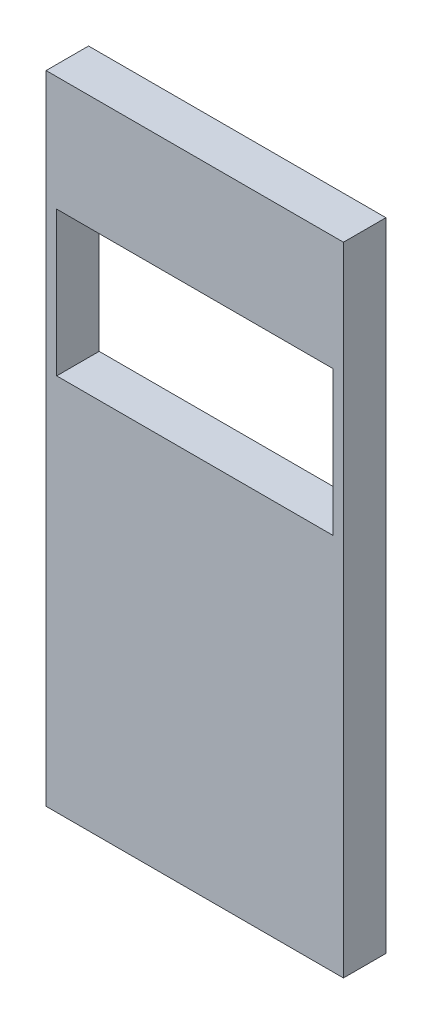
ISO-10303-21;
HEADER;
FILE_DESCRIPTION(('STEP AP214'),'2;1');
FILE_NAME('part.step','',(''),(''),'','','');
FILE_SCHEMA(('AUTOMOTIVE_DESIGN { 1 0 10303 214 1 1 1 1 }'));
ENDSEC;
DATA;
#1=APPLICATION_CONTEXT('core data for automotive mechanical design processes');
#2=APPLICATION_PROTOCOL_DEFINITION('international standard','automotive_design',2000,#1);
#3=PRODUCT_CONTEXT('',#1,'mechanical');
#4=PRODUCT('Part','Part','',(#3));
#5=PRODUCT_RELATED_PRODUCT_CATEGORY('part','',(#4));
#6=PRODUCT_DEFINITION_FORMATION('','',#4);
#7=PRODUCT_DEFINITION_CONTEXT('part definition',#1,'design');
#8=PRODUCT_DEFINITION('design','',#6,#7);
#9=PRODUCT_DEFINITION_SHAPE('','',#8);
#10=(LENGTH_UNIT() NAMED_UNIT(*) SI_UNIT(.MILLI.,.METRE.));
#11=(NAMED_UNIT(*) PLANE_ANGLE_UNIT() SI_UNIT($,.RADIAN.));
#12=(NAMED_UNIT(*) SI_UNIT($,.STERADIAN.) SOLID_ANGLE_UNIT());
#13=UNCERTAINTY_MEASURE_WITH_UNIT(LENGTH_MEASURE(1.E-05),#10,'distance_accuracy_value','');
#14=(GEOMETRIC_REPRESENTATION_CONTEXT(3) GLOBAL_UNCERTAINTY_ASSIGNED_CONTEXT((#13)) GLOBAL_UNIT_ASSIGNED_CONTEXT((#10,
#11,#12)) REPRESENTATION_CONTEXT('',''));
#15=CARTESIAN_POINT('',(0.,0.,0.));
#16=DIRECTION('',(0.,0.,1.));
#17=DIRECTION('',(1.,0.,0.));
#18=AXIS2_PLACEMENT_3D('',#15,#16,#17);
#19=CARTESIAN_POINT('',(-35.,-75.,10.));
#20=DIRECTION('',(1.,0.,0.));
#21=DIRECTION('',(0.,0.,-1.));
#22=AXIS2_PLACEMENT_3D('',#19,#20,#21);
#23=PLANE('',#22);
#24=DIRECTION('',(0.,-1.,0.));
#25=VECTOR('',#24,1.);
#26=CARTESIAN_POINT('',(-35.,-75.,0.));
#27=LINE('',#26,#25);
#28=CARTESIAN_POINT('',(-35.,75.,0.));
#29=VERTEX_POINT('',#28);
#30=CARTESIAN_POINT('',(-35.,-75.,0.));
#31=VERTEX_POINT('',#30);
#32=EDGE_CURVE('E130',#29,#31,#27,.T.);
#33=ORIENTED_EDGE('',*,*,#32,.T.);
#34=DIRECTION('',(0.,0.,-1.));
#35=VECTOR('',#34,1.);
#36=CARTESIAN_POINT('',(-35.,-75.,10.));
#37=LINE('',#36,#35);
#38=CARTESIAN_POINT('',(-35.,-75.,10.));
#39=VERTEX_POINT('',#38);
#40=EDGE_CURVE('E11',#39,#31,#37,.T.);
#41=ORIENTED_EDGE('',*,*,#40,.F.);
#42=DIRECTION('',(0.,-1.,0.));
#43=VECTOR('',#42,1.);
#44=CARTESIAN_POINT('',(-35.,-75.,10.));
#45=LINE('',#44,#43);
#46=CARTESIAN_POINT('',(-35.,75.,10.));
#47=VERTEX_POINT('',#46);
#48=EDGE_CURVE('E134',#47,#39,#45,.T.);
#49=ORIENTED_EDGE('',*,*,#48,.F.);
#50=DIRECTION('',(0.,0.,-1.));
#51=VECTOR('',#50,1.);
#52=CARTESIAN_POINT('',(-35.,75.,10.));
#53=LINE('',#52,#51);
#54=EDGE_CURVE('E144',#47,#29,#53,.T.);
#55=ORIENTED_EDGE('',*,*,#54,.T.);
#56=EDGE_LOOP('',(#33,#41,#49,#55));
#57=FACE_BOUND('',#56,.T.);
#58=ADVANCED_FACE('F35',(#57),#23,.F.);
#59=CARTESIAN_POINT('',(35.,-75.,10.));
#60=DIRECTION('',(0.,1.,0.));
#61=DIRECTION('',(-1.,0.,0.));
#62=AXIS2_PLACEMENT_3D('',#59,#60,#61);
#63=PLANE('',#62);
#64=DIRECTION('',(1.,0.,0.));
#65=VECTOR('',#64,1.);
#66=CARTESIAN_POINT('',(35.,-75.,0.));
#67=LINE('',#66,#65);
#68=CARTESIAN_POINT('',(35.,-75.,0.));
#69=VERTEX_POINT('',#68);
#70=EDGE_CURVE('E147',#31,#69,#67,.T.);
#71=ORIENTED_EDGE('',*,*,#70,.T.);
#72=DIRECTION('',(0.,0.,-1.));
#73=VECTOR('',#72,1.);
#74=CARTESIAN_POINT('',(35.,-75.,10.));
#75=LINE('',#74,#73);
#76=CARTESIAN_POINT('',(35.,-75.,10.));
#77=VERTEX_POINT('',#76);
#78=EDGE_CURVE('E42',#77,#69,#75,.T.);
#79=ORIENTED_EDGE('',*,*,#78,.F.);
#80=DIRECTION('',(1.,0.,0.));
#81=VECTOR('',#80,1.);
#82=CARTESIAN_POINT('',(35.,-75.,10.));
#83=LINE('',#82,#81);
#84=EDGE_CURVE('E137',#39,#77,#83,.T.);
#85=ORIENTED_EDGE('',*,*,#84,.F.);
#86=ORIENTED_EDGE('',*,*,#40,.T.);
#87=EDGE_LOOP('',(#71,#79,#85,#86));
#88=FACE_BOUND('',#87,.T.);
#89=ADVANCED_FACE('F175',(#88),#63,.F.);
#90=CARTESIAN_POINT('',(35.,-75.,10.));
#91=DIRECTION('',(-1.,0.,0.));
#92=DIRECTION('',(0.,0.,1.));
#93=AXIS2_PLACEMENT_3D('',#90,#91,#92);
#94=PLANE('',#93);
#95=DIRECTION('',(0.,1.,0.));
#96=VECTOR('',#95,1.);
#97=CARTESIAN_POINT('',(35.,-75.,0.));
#98=LINE('',#97,#96);
#99=CARTESIAN_POINT('',(35.,75.,0.));
#100=VERTEX_POINT('',#99);
#101=EDGE_CURVE('E149',#69,#100,#98,.T.);
#102=ORIENTED_EDGE('',*,*,#101,.T.);
#103=DIRECTION('',(0.,0.,-1.));
#104=VECTOR('',#103,1.);
#105=CARTESIAN_POINT('',(35.,75.,10.));
#106=LINE('',#105,#104);
#107=CARTESIAN_POINT('',(35.,75.,10.));
#108=VERTEX_POINT('',#107);
#109=EDGE_CURVE('E154',#108,#100,#106,.T.);
#110=ORIENTED_EDGE('',*,*,#109,.F.);
#111=DIRECTION('',(0.,1.,0.));
#112=VECTOR('',#111,1.);
#113=CARTESIAN_POINT('',(35.,-75.,10.));
#114=LINE('',#113,#112);
#115=EDGE_CURVE('E140',#77,#108,#114,.T.);
#116=ORIENTED_EDGE('',*,*,#115,.F.);
#117=ORIENTED_EDGE('',*,*,#78,.T.);
#118=EDGE_LOOP('',(#102,#110,#116,#117));
#119=FACE_BOUND('',#118,.T.);
#120=ADVANCED_FACE('F161',(#119),#94,.F.);
#121=CARTESIAN_POINT('',(35.,75.,10.));
#122=DIRECTION('',(0.,-1.,0.));
#123=DIRECTION('',(1.,0.,0.));
#124=AXIS2_PLACEMENT_3D('',#121,#122,#123);
#125=PLANE('',#124);
#126=DIRECTION('',(-1.,0.,0.));
#127=VECTOR('',#126,1.);
#128=CARTESIAN_POINT('',(35.,75.,0.));
#129=LINE('',#128,#127);
#130=EDGE_CURVE('E138',#100,#29,#129,.T.);
#131=ORIENTED_EDGE('',*,*,#130,.T.);
#132=ORIENTED_EDGE('',*,*,#54,.F.);
#133=DIRECTION('',(-1.,0.,0.));
#134=VECTOR('',#133,1.);
#135=CARTESIAN_POINT('',(35.,75.,10.));
#136=LINE('',#135,#134);
#137=EDGE_CURVE('E142',#108,#47,#136,.T.);
#138=ORIENTED_EDGE('',*,*,#137,.F.);
#139=ORIENTED_EDGE('',*,*,#109,.T.);
#140=EDGE_LOOP('',(#131,#132,#138,#139));
#141=FACE_BOUND('',#140,.T.);
#142=ADVANCED_FACE('F170',(#141),#125,.F.);
#143=CARTESIAN_POINT('',(0.,0.,10.));
#144=DIRECTION('',(0.,0.,1.));
#145=DIRECTION('',(1.,0.,0.));
#146=AXIS2_PLACEMENT_3D('',#143,#144,#145);
#147=PLANE('',#146);
#148=DIRECTION('',(0.,1.,0.));
#149=VECTOR('',#148,1.);
#150=CARTESIAN_POINT('',(-32.5,14.,10.));
#151=LINE('',#150,#149);
#152=CARTESIAN_POINT('',(-32.5,14.,10.));
#153=VERTEX_POINT('',#152);
#154=CARTESIAN_POINT('',(-32.5,48.,10.));
#155=VERTEX_POINT('',#154);
#156=EDGE_CURVE('E101',#153,#155,#151,.T.);
#157=ORIENTED_EDGE('',*,*,#156,.T.);
#158=DIRECTION('',(1.,0.,0.));
#159=VECTOR('',#158,1.);
#160=CARTESIAN_POINT('',(-32.5,48.,10.));
#161=LINE('',#160,#159);
#162=CARTESIAN_POINT('',(32.5,48.,10.));
#163=VERTEX_POINT('',#162);
#164=EDGE_CURVE('E107',#155,#163,#161,.T.);
#165=ORIENTED_EDGE('',*,*,#164,.T.);
#166=DIRECTION('',(0.,1.,0.));
#167=VECTOR('',#166,1.);
#168=CARTESIAN_POINT('',(32.5,14.,10.));
#169=LINE('',#168,#167);
#170=CARTESIAN_POINT('',(32.5,14.,10.));
#171=VERTEX_POINT('',#170);
#172=EDGE_CURVE('E111',#171,#163,#169,.T.);
#173=ORIENTED_EDGE('',*,*,#172,.F.);
#174=DIRECTION('',(1.,0.,0.));
#175=VECTOR('',#174,1.);
#176=CARTESIAN_POINT('',(-32.5,14.,10.));
#177=LINE('',#176,#175);
#178=EDGE_CURVE('E104',#153,#171,#177,.T.);
#179=ORIENTED_EDGE('',*,*,#178,.F.);
#180=EDGE_LOOP('',(#157,#165,#173,#179));
#181=FACE_BOUND('',#180,.T.);
#182=ORIENTED_EDGE('',*,*,#48,.T.);
#183=ORIENTED_EDGE('',*,*,#84,.T.);
#184=ORIENTED_EDGE('',*,*,#115,.T.);
#185=ORIENTED_EDGE('',*,*,#137,.T.);
#186=EDGE_LOOP('',(#182,#183,#184,#185));
#187=FACE_BOUND('',#186,.T.);
#188=ADVANCED_FACE('F113',(#181,#187),#147,.T.);
#189=CARTESIAN_POINT('',(0.,0.,0.));
#190=DIRECTION('',(0.,0.,1.));
#191=DIRECTION('',(1.,0.,0.));
#192=AXIS2_PLACEMENT_3D('',#189,#190,#191);
#193=PLANE('',#192);
#194=DIRECTION('',(1.,0.,0.));
#195=VECTOR('',#194,1.);
#196=CARTESIAN_POINT('',(-32.5,48.,0.));
#197=LINE('',#196,#195);
#198=CARTESIAN_POINT('',(-32.5,48.,0.));
#199=VERTEX_POINT('',#198);
#200=CARTESIAN_POINT('',(32.5,48.,0.));
#201=VERTEX_POINT('',#200);
#202=EDGE_CURVE('E124',#199,#201,#197,.T.);
#203=ORIENTED_EDGE('',*,*,#202,.F.);
#204=DIRECTION('',(0.,1.,0.));
#205=VECTOR('',#204,1.);
#206=CARTESIAN_POINT('',(-32.5,14.,0.));
#207=LINE('',#206,#205);
#208=CARTESIAN_POINT('',(-32.5,14.,0.));
#209=VERTEX_POINT('',#208);
#210=EDGE_CURVE('E57',#209,#199,#207,.T.);
#211=ORIENTED_EDGE('',*,*,#210,.F.);
#212=DIRECTION('',(1.,0.,0.));
#213=VECTOR('',#212,1.);
#214=CARTESIAN_POINT('',(-32.5,14.,0.));
#215=LINE('',#214,#213);
#216=CARTESIAN_POINT('',(32.5,14.,0.));
#217=VERTEX_POINT('',#216);
#218=EDGE_CURVE('E115',#209,#217,#215,.T.);
#219=ORIENTED_EDGE('',*,*,#218,.T.);
#220=DIRECTION('',(0.,1.,0.));
#221=VECTOR('',#220,1.);
#222=CARTESIAN_POINT('',(32.5,14.,0.));
#223=LINE('',#222,#221);
#224=EDGE_CURVE('E118',#217,#201,#223,.T.);
#225=ORIENTED_EDGE('',*,*,#224,.T.);
#226=EDGE_LOOP('',(#203,#211,#219,#225));
#227=FACE_BOUND('',#226,.T.);
#228=ORIENTED_EDGE('',*,*,#32,.F.);
#229=ORIENTED_EDGE('',*,*,#130,.F.);
#230=ORIENTED_EDGE('',*,*,#101,.F.);
#231=ORIENTED_EDGE('',*,*,#70,.F.);
#232=EDGE_LOOP('',(#228,#229,#230,#231));
#233=FACE_BOUND('',#232,.T.);
#234=ADVANCED_FACE('F167',(#227,#233),#193,.F.);
#235=CARTESIAN_POINT('',(-32.5,14.,10.));
#236=DIRECTION('',(-1.,0.,0.));
#237=DIRECTION('',(0.,0.,1.));
#238=AXIS2_PLACEMENT_3D('',#235,#236,#237);
#239=PLANE('',#238);
#240=ORIENTED_EDGE('',*,*,#210,.T.);
#241=DIRECTION('',(0.,0.,-1.));
#242=VECTOR('',#241,1.);
#243=CARTESIAN_POINT('',(-32.5,48.,10.));
#244=LINE('',#243,#242);
#245=EDGE_CURVE('E98',#155,#199,#244,.T.);
#246=ORIENTED_EDGE('',*,*,#245,.F.);
#247=ORIENTED_EDGE('',*,*,#156,.F.);
#248=DIRECTION('',(0.,0.,-1.));
#249=VECTOR('',#248,1.);
#250=CARTESIAN_POINT('',(-32.5,14.,10.));
#251=LINE('',#250,#249);
#252=EDGE_CURVE('E128',#153,#209,#251,.T.);
#253=ORIENTED_EDGE('',*,*,#252,.T.);
#254=EDGE_LOOP('',(#240,#246,#247,#253));
#255=FACE_BOUND('',#254,.T.);
#256=ADVANCED_FACE('F99',(#255),#239,.F.);
#257=CARTESIAN_POINT('',(-32.5,14.,10.));
#258=DIRECTION('',(0.,1.,0.));
#259=DIRECTION('',(-1.,0.,0.));
#260=AXIS2_PLACEMENT_3D('',#257,#258,#259);
#261=PLANE('',#260);
#262=ORIENTED_EDGE('',*,*,#218,.F.);
#263=ORIENTED_EDGE('',*,*,#252,.F.);
#264=ORIENTED_EDGE('',*,*,#178,.T.);
#265=DIRECTION('',(0.,0.,-1.));
#266=VECTOR('',#265,1.);
#267=CARTESIAN_POINT('',(32.5,14.,10.));
#268=LINE('',#267,#266);
#269=EDGE_CURVE('E131',#171,#217,#268,.T.);
#270=ORIENTED_EDGE('',*,*,#269,.T.);
#271=EDGE_LOOP('',(#262,#263,#264,#270));
#272=FACE_BOUND('',#271,.T.);
#273=ADVANCED_FACE('F192',(#272),#261,.T.);
#274=CARTESIAN_POINT('',(32.5,14.,10.));
#275=DIRECTION('',(-1.,0.,0.));
#276=DIRECTION('',(0.,0.,1.));
#277=AXIS2_PLACEMENT_3D('',#274,#275,#276);
#278=PLANE('',#277);
#279=ORIENTED_EDGE('',*,*,#224,.F.);
#280=ORIENTED_EDGE('',*,*,#269,.F.);
#281=ORIENTED_EDGE('',*,*,#172,.T.);
#282=DIRECTION('',(0.,0.,-1.));
#283=VECTOR('',#282,1.);
#284=CARTESIAN_POINT('',(32.5,48.,10.));
#285=LINE('',#284,#283);
#286=EDGE_CURVE('E49',#163,#201,#285,.T.);
#287=ORIENTED_EDGE('',*,*,#286,.T.);
#288=EDGE_LOOP('',(#279,#280,#281,#287));
#289=FACE_BOUND('',#288,.T.);
#290=ADVANCED_FACE('F195',(#289),#278,.T.);
#291=CARTESIAN_POINT('',(-32.5,48.,10.));
#292=DIRECTION('',(0.,1.,0.));
#293=DIRECTION('',(-1.,0.,0.));
#294=AXIS2_PLACEMENT_3D('',#291,#292,#293);
#295=PLANE('',#294);
#296=ORIENTED_EDGE('',*,*,#202,.T.);
#297=ORIENTED_EDGE('',*,*,#286,.F.);
#298=ORIENTED_EDGE('',*,*,#164,.F.);
#299=ORIENTED_EDGE('',*,*,#245,.T.);
#300=EDGE_LOOP('',(#296,#297,#298,#299));
#301=FACE_BOUND('',#300,.T.);
#302=ADVANCED_FACE('F108',(#301),#295,.F.);
#303=CLOSED_SHELL('',(#58,#89,#120,#142,#188,#234,#256,#273,#290,#302));
#304=MANIFOLD_SOLID_BREP('B2',#303);
#305=ADVANCED_BREP_SHAPE_REPRESENTATION('',(#18,#304),#14);
#306=SHAPE_DEFINITION_REPRESENTATION(#9,#305);
ENDSEC;
END-ISO-10303-21;
